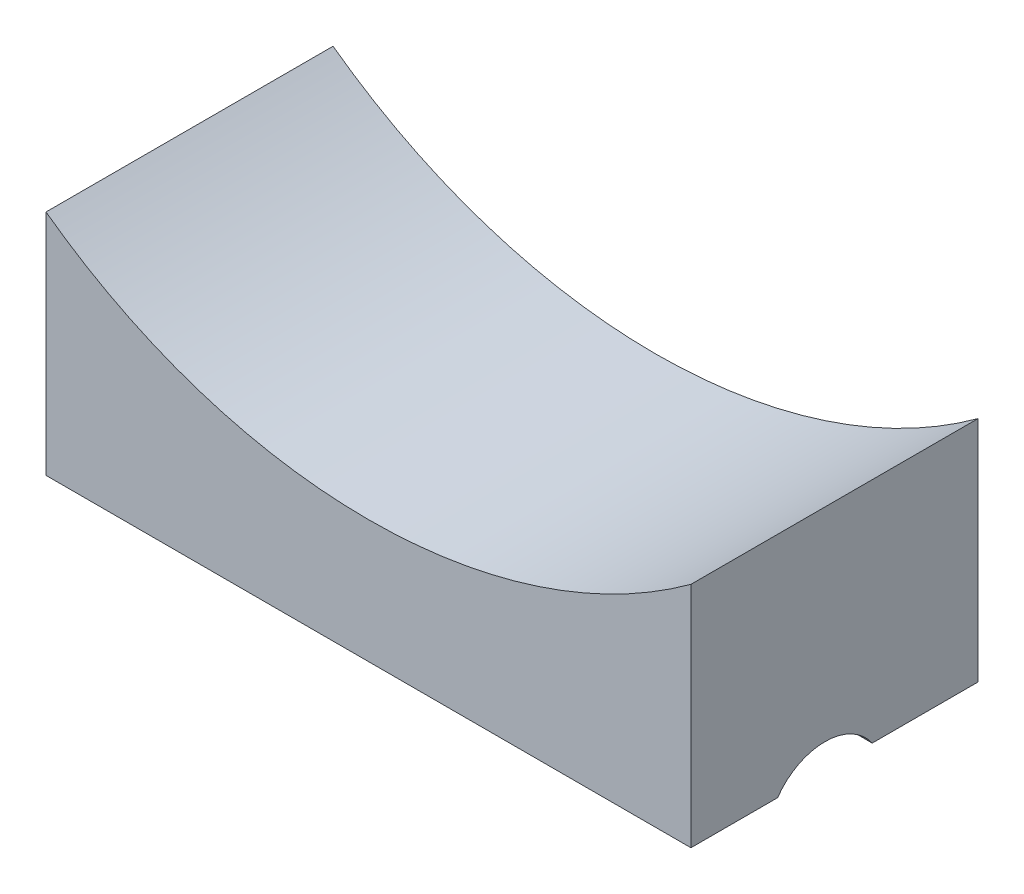
ISO-10303-21;
HEADER;
FILE_DESCRIPTION(('STEP AP214'),'2;1');
FILE_NAME('part.step','',(''),(''),'','','');
FILE_SCHEMA(('AUTOMOTIVE_DESIGN { 1 0 10303 214 1 1 1 1 }'));
ENDSEC;
DATA;
#1=APPLICATION_CONTEXT('core data for automotive mechanical design processes');
#2=APPLICATION_PROTOCOL_DEFINITION('international standard','automotive_design',2000,#1);
#3=PRODUCT_CONTEXT('',#1,'mechanical');
#4=PRODUCT('Part','Part','',(#3));
#5=PRODUCT_RELATED_PRODUCT_CATEGORY('part','',(#4));
#6=PRODUCT_DEFINITION_FORMATION('','',#4);
#7=PRODUCT_DEFINITION_CONTEXT('part definition',#1,'design');
#8=PRODUCT_DEFINITION('design','',#6,#7);
#9=PRODUCT_DEFINITION_SHAPE('','',#8);
#10=(LENGTH_UNIT() NAMED_UNIT(*) SI_UNIT(.MILLI.,.METRE.));
#11=(NAMED_UNIT(*) PLANE_ANGLE_UNIT() SI_UNIT($,.RADIAN.));
#12=(NAMED_UNIT(*) SI_UNIT($,.STERADIAN.) SOLID_ANGLE_UNIT());
#13=UNCERTAINTY_MEASURE_WITH_UNIT(LENGTH_MEASURE(1.E-05),#10,'distance_accuracy_value','');
#14=(GEOMETRIC_REPRESENTATION_CONTEXT(3) GLOBAL_UNCERTAINTY_ASSIGNED_CONTEXT((#13)) GLOBAL_UNIT_ASSIGNED_CONTEXT((#10,
#11,#12)) REPRESENTATION_CONTEXT('',''));
#15=CARTESIAN_POINT('',(0.,0.,0.));
#16=DIRECTION('',(0.,0.,1.));
#17=DIRECTION('',(1.,0.,0.));
#18=AXIS2_PLACEMENT_3D('',#15,#16,#17);
#19=CARTESIAN_POINT('',(33.7,0.,0.));
#20=DIRECTION('',(0.,1.,0.));
#21=DIRECTION('',(0.,0.,1.));
#22=AXIS2_PLACEMENT_3D('',#19,#20,#21);
#23=PLANE('',#22);
#24=DIRECTION('',(0.,0.,-1.));
#25=VECTOR('',#24,1.);
#26=CARTESIAN_POINT('',(0.,0.,0.));
#27=LINE('',#26,#25);
#28=CARTESIAN_POINT('',(0.,0.,0.));
#29=VERTEX_POINT('',#28);
#30=CARTESIAN_POINT('',(0.,0.,-2.19167388793148));
#31=VERTEX_POINT('',#30);
#32=EDGE_CURVE('E143',#29,#31,#27,.T.);
#33=ORIENTED_EDGE('',*,*,#32,.T.);
#34=DIRECTION('',(1.,0.,0.));
#35=VECTOR('',#34,1.);
#36=CARTESIAN_POINT('',(0.,0.,-2.19167388793148));
#37=LINE('',#36,#35);
#38=CARTESIAN_POINT('',(1.9,0.,-2.19167388793148));
#39=VERTEX_POINT('',#38);
#40=EDGE_CURVE('E119',#31,#39,#37,.T.);
#41=ORIENTED_EDGE('',*,*,#40,.T.);
#42=DIRECTION('',(0.,0.,-1.));
#43=VECTOR('',#42,1.);
#44=CARTESIAN_POINT('',(1.9,0.,0.));
#45=LINE('',#44,#43);
#46=CARTESIAN_POINT('',(1.9,0.,-0.976222115648685));
#47=VERTEX_POINT('',#46);
#48=EDGE_CURVE('E48',#47,#39,#45,.T.);
#49=ORIENTED_EDGE('',*,*,#48,.F.);
#50=DIRECTION('',(1.,0.,0.));
#51=VECTOR('',#50,1.);
#52=CARTESIAN_POINT('',(1.9,0.,-0.976222115648685));
#53=LINE('',#52,#51);
#54=CARTESIAN_POINT('',(9.2,0.,-0.976222115648685));
#55=VERTEX_POINT('',#54);
#56=EDGE_CURVE('E11',#47,#55,#53,.T.);
#57=ORIENTED_EDGE('',*,*,#56,.T.);
#58=DIRECTION('',(0.,0.,-1.));
#59=VECTOR('',#58,1.);
#60=CARTESIAN_POINT('',(9.2,0.,0.));
#61=LINE('',#60,#59);
#62=CARTESIAN_POINT('',(9.2,0.,-4.52815858113834));
#63=VERTEX_POINT('',#62);
#64=EDGE_CURVE('E189',#55,#63,#61,.T.);
#65=ORIENTED_EDGE('',*,*,#64,.T.);
#66=DIRECTION('',(1.,0.,0.));
#67=VECTOR('',#66,1.);
#68=CARTESIAN_POINT('',(9.2,0.,-4.52815858113834));
#69=LINE('',#68,#67);
#70=CARTESIAN_POINT('',(33.7,0.,-4.52815858113834));
#71=VERTEX_POINT('',#70);
#72=EDGE_CURVE('E203',#71,#63,#69,.F.);
#73=ORIENTED_EDGE('',*,*,#72,.F.);
#74=DIRECTION('',(0.,0.,-1.));
#75=VECTOR('',#74,1.);
#76=CARTESIAN_POINT('',(33.7,0.,0.));
#77=LINE('',#76,#75);
#78=CARTESIAN_POINT('',(33.7,0.,0.));
#79=VERTEX_POINT('',#78);
#80=EDGE_CURVE('E220',#79,#71,#77,.T.);
#81=ORIENTED_EDGE('',*,*,#80,.F.);
#82=DIRECTION('',(-1.,0.,0.));
#83=VECTOR('',#82,1.);
#84=CARTESIAN_POINT('',(33.7,0.,0.));
#85=LINE('',#84,#83);
#86=EDGE_CURVE('E158',#79,#29,#85,.T.);
#87=ORIENTED_EDGE('',*,*,#86,.T.);
#88=EDGE_LOOP('',(#33,#41,#49,#57,#65,#73,#81,#87));
#89=FACE_BOUND('',#88,.T.);
#90=ADVANCED_FACE('F39',(#89),#23,.F.);
#91=CARTESIAN_POINT('',(1.9,0.,-11.8083261120685));
#92=VERTEX_POINT('',#91);
#93=CARTESIAN_POINT('',(1.9,0.,-13.0237778843513));
#94=VERTEX_POINT('',#93);
#95=EDGE_CURVE('E134',#92,#94,#45,.T.);
#96=ORIENTED_EDGE('',*,*,#95,.F.);
#97=DIRECTION('',(1.,0.,0.));
#98=VECTOR('',#97,1.);
#99=CARTESIAN_POINT('',(0.,0.,-11.8083261120685));
#100=LINE('',#99,#98);
#101=CARTESIAN_POINT('',(0.,0.,-11.8083261120685));
#102=VERTEX_POINT('',#101);
#103=EDGE_CURVE('E55',#92,#102,#100,.F.);
#104=ORIENTED_EDGE('',*,*,#103,.T.);
#105=CARTESIAN_POINT('',(0.,0.,-15.));
#106=VERTEX_POINT('',#105);
#107=EDGE_CURVE('E131',#102,#106,#27,.T.);
#108=ORIENTED_EDGE('',*,*,#107,.T.);
#109=DIRECTION('',(-1.,0.,0.));
#110=VECTOR('',#109,1.);
#111=CARTESIAN_POINT('',(33.7,0.,-15.));
#112=LINE('',#111,#110);
#113=CARTESIAN_POINT('',(33.7,0.,-15.));
#114=VERTEX_POINT('',#113);
#115=EDGE_CURVE('E155',#114,#106,#112,.T.);
#116=ORIENTED_EDGE('',*,*,#115,.F.);
#117=CARTESIAN_POINT('',(33.7,0.,-9.47184141886166));
#118=VERTEX_POINT('',#117);
#119=EDGE_CURVE('E219',#118,#114,#77,.T.);
#120=ORIENTED_EDGE('',*,*,#119,.F.);
#121=DIRECTION('',(1.,0.,0.));
#122=VECTOR('',#121,1.);
#123=CARTESIAN_POINT('',(9.2,0.,-9.47184141886166));
#124=LINE('',#123,#122);
#125=CARTESIAN_POINT('',(9.2,0.,-9.47184141886166));
#126=VERTEX_POINT('',#125);
#127=EDGE_CURVE('E63',#126,#118,#124,.T.);
#128=ORIENTED_EDGE('',*,*,#127,.F.);
#129=CARTESIAN_POINT('',(9.2,0.,-13.0237778843513));
#130=VERTEX_POINT('',#129);
#131=EDGE_CURVE('E182',#126,#130,#61,.T.);
#132=ORIENTED_EDGE('',*,*,#131,.T.);
#133=DIRECTION('',(1.,0.,0.));
#134=VECTOR('',#133,1.);
#135=CARTESIAN_POINT('',(1.9,0.,-13.0237778843513));
#136=LINE('',#135,#134);
#137=EDGE_CURVE('E166',#130,#94,#136,.F.);
#138=ORIENTED_EDGE('',*,*,#137,.T.);
#139=EDGE_LOOP('',(#96,#104,#108,#116,#120,#128,#132,#138));
#140=FACE_BOUND('',#139,.T.);
#141=ADVANCED_FACE('F129',(#140),#23,.F.);
#142=CARTESIAN_POINT('',(33.7,0.,0.));
#143=DIRECTION('',(0.,0.,-1.));
#144=DIRECTION('',(-1.,0.,0.));
#145=AXIS2_PLACEMENT_3D('',#142,#143,#144);
#146=PLANE('',#145);
#147=DIRECTION('',(0.,-1.,0.));
#148=VECTOR('',#147,1.);
#149=CARTESIAN_POINT('',(33.7,0.,0.));
#150=LINE('',#149,#148);
#151=CARTESIAN_POINT('',(33.7,11.9216957945346,0.));
#152=VERTEX_POINT('',#151);
#153=EDGE_CURVE('E154',#152,#79,#150,.T.);
#154=ORIENTED_EDGE('',*,*,#153,.F.);
#155=CARTESIAN_POINT('',(16.85,35.,0.));
#156=DIRECTION('',(0.,0.,1.));
#157=DIRECTION('',(1.,0.,0.));
#158=AXIS2_PLACEMENT_3D('',#155,#156,#157);
#159=CIRCLE('',#158,28.575);
#160=CARTESIAN_POINT('',(0.,11.9216957945346,0.));
#161=VERTEX_POINT('',#160);
#162=EDGE_CURVE('E207',#161,#152,#159,.T.);
#163=ORIENTED_EDGE('',*,*,#162,.F.);
#164=DIRECTION('',(0.,-1.,0.));
#165=VECTOR('',#164,1.);
#166=CARTESIAN_POINT('',(0.,0.,0.));
#167=LINE('',#166,#165);
#168=EDGE_CURVE('E144',#161,#29,#167,.T.);
#169=ORIENTED_EDGE('',*,*,#168,.T.);
#170=ORIENTED_EDGE('',*,*,#86,.F.);
#171=EDGE_LOOP('',(#154,#163,#169,#170));
#172=FACE_BOUND('',#171,.T.);
#173=ADVANCED_FACE('F41',(#172),#146,.F.);
#174=CARTESIAN_POINT('',(33.7,0.,-15.));
#175=DIRECTION('',(0.,0.,1.));
#176=DIRECTION('',(0.,-1.,0.));
#177=AXIS2_PLACEMENT_3D('',#174,#175,#176);
#178=PLANE('',#177);
#179=DIRECTION('',(0.,1.,0.));
#180=VECTOR('',#179,1.);
#181=CARTESIAN_POINT('',(0.,0.,-15.));
#182=LINE('',#181,#180);
#183=CARTESIAN_POINT('',(0.,11.9216957945346,-15.));
#184=VERTEX_POINT('',#183);
#185=EDGE_CURVE('E141',#106,#184,#182,.T.);
#186=ORIENTED_EDGE('',*,*,#185,.T.);
#187=CARTESIAN_POINT('',(16.85,35.,-15.));
#188=DIRECTION('',(0.,0.,1.));
#189=DIRECTION('',(1.,0.,0.));
#190=AXIS2_PLACEMENT_3D('',#187,#188,#189);
#191=CIRCLE('',#190,28.575);
#192=CARTESIAN_POINT('',(33.7,11.9216957945346,-15.));
#193=VERTEX_POINT('',#192);
#194=EDGE_CURVE('E208',#184,#193,#191,.T.);
#195=ORIENTED_EDGE('',*,*,#194,.T.);
#196=DIRECTION('',(0.,1.,0.));
#197=VECTOR('',#196,1.);
#198=CARTESIAN_POINT('',(33.7,0.,-15.));
#199=LINE('',#198,#197);
#200=EDGE_CURVE('E159',#114,#193,#199,.T.);
#201=ORIENTED_EDGE('',*,*,#200,.F.);
#202=ORIENTED_EDGE('',*,*,#115,.T.);
#203=EDGE_LOOP('',(#186,#195,#201,#202));
#204=FACE_BOUND('',#203,.T.);
#205=ADVANCED_FACE('F230',(#204),#178,.F.);
#206=CARTESIAN_POINT('',(33.7,0.,0.));
#207=DIRECTION('',(-1.,0.,0.));
#208=DIRECTION('',(0.,0.,1.));
#209=AXIS2_PLACEMENT_3D('',#206,#207,#208);
#210=PLANE('',#209);
#211=CARTESIAN_POINT('',(33.7,-1.7,-7.));
#212=DIRECTION('',(-1.,0.,0.));
#213=DIRECTION('',(0.,0.,1.));
#214=AXIS2_PLACEMENT_3D('',#211,#212,#213);
#215=CIRCLE('',#214,3.);
#216=EDGE_CURVE('E193',#71,#118,#215,.T.);
#217=ORIENTED_EDGE('',*,*,#216,.T.);
#218=ORIENTED_EDGE('',*,*,#119,.T.);
#219=ORIENTED_EDGE('',*,*,#200,.T.);
#220=DIRECTION('',(0.,0.,1.));
#221=VECTOR('',#220,1.);
#222=CARTESIAN_POINT('',(33.7,11.9216957945347,-15.));
#223=LINE('',#222,#221);
#224=EDGE_CURVE('E148',#193,#152,#223,.T.);
#225=ORIENTED_EDGE('',*,*,#224,.T.);
#226=ORIENTED_EDGE('',*,*,#153,.T.);
#227=ORIENTED_EDGE('',*,*,#80,.T.);
#228=EDGE_LOOP('',(#217,#218,#219,#225,#226,#227));
#229=FACE_BOUND('',#228,.T.);
#230=ADVANCED_FACE('F227',(#229),#210,.F.);
#231=CARTESIAN_POINT('',(0.,0.,0.));
#232=DIRECTION('',(-1.,0.,0.));
#233=DIRECTION('',(0.,0.,1.));
#234=AXIS2_PLACEMENT_3D('',#231,#232,#233);
#235=PLANE('',#234);
#236=CARTESIAN_POINT('',(0.,-1.7,-7.));
#237=DIRECTION('',(1.,0.,0.));
#238=DIRECTION('',(0.,0.,-1.));
#239=AXIS2_PLACEMENT_3D('',#236,#237,#238);
#240=CIRCLE('',#239,5.1);
#241=EDGE_CURVE('E116',#102,#31,#240,.T.);
#242=ORIENTED_EDGE('',*,*,#241,.T.);
#243=ORIENTED_EDGE('',*,*,#32,.F.);
#244=ORIENTED_EDGE('',*,*,#168,.F.);
#245=DIRECTION('',(0.,0.,1.));
#246=VECTOR('',#245,1.);
#247=CARTESIAN_POINT('',(0.,11.9216957945347,-15.));
#248=LINE('',#247,#246);
#249=EDGE_CURVE('E163',#184,#161,#248,.T.);
#250=ORIENTED_EDGE('',*,*,#249,.F.);
#251=ORIENTED_EDGE('',*,*,#185,.F.);
#252=ORIENTED_EDGE('',*,*,#107,.F.);
#253=EDGE_LOOP('',(#242,#243,#244,#250,#251,#252));
#254=FACE_BOUND('',#253,.T.);
#255=ADVANCED_FACE('F138',(#254),#235,.T.);
#256=CARTESIAN_POINT('',(16.85,35.,-15.));
#257=DIRECTION('',(0.,0.,1.));
#258=DIRECTION('',(1.,0.,0.));
#259=AXIS2_PLACEMENT_3D('',#256,#257,#258);
#260=CYLINDRICAL_SURFACE('',#259,28.575);
#261=ORIENTED_EDGE('',*,*,#194,.F.);
#262=ORIENTED_EDGE('',*,*,#249,.T.);
#263=ORIENTED_EDGE('',*,*,#162,.T.);
#264=ORIENTED_EDGE('',*,*,#224,.F.);
#265=EDGE_LOOP('',(#261,#262,#263,#264));
#266=FACE_BOUND('',#265,.T.);
#267=ADVANCED_FACE('F232',(#266),#260,.F.);
#268=CARTESIAN_POINT('',(9.2,-1.7,-7.));
#269=DIRECTION('',(1.,0.,0.));
#270=DIRECTION('',(0.,0.,-1.));
#271=AXIS2_PLACEMENT_3D('',#268,#269,#270);
#272=CYLINDRICAL_SURFACE('',#271,3.);
#273=ORIENTED_EDGE('',*,*,#72,.T.);
#274=CARTESIAN_POINT('',(9.2,-1.7,-7.));
#275=DIRECTION('',(-1.,0.,0.));
#276=DIRECTION('',(0.,0.,1.));
#277=AXIS2_PLACEMENT_3D('',#274,#275,#276);
#278=CIRCLE('',#277,3.);
#279=EDGE_CURVE('E196',#63,#126,#278,.T.);
#280=ORIENTED_EDGE('',*,*,#279,.T.);
#281=ORIENTED_EDGE('',*,*,#127,.T.);
#282=ORIENTED_EDGE('',*,*,#216,.F.);
#283=EDGE_LOOP('',(#273,#280,#281,#282));
#284=FACE_BOUND('',#283,.T.);
#285=ADVANCED_FACE('F240',(#284),#272,.F.);
#286=CARTESIAN_POINT('',(1.9,-1.55,-7.));
#287=DIRECTION('',(1.,0.,0.));
#288=DIRECTION('',(0.,0.,-1.));
#289=AXIS2_PLACEMENT_3D('',#286,#287,#288);
#290=CYLINDRICAL_SURFACE('',#289,6.22);
#291=CARTESIAN_POINT('',(1.9,-1.55,-7.));
#292=DIRECTION('',(1.,0.,0.));
#293=DIRECTION('',(0.,0.,-1.));
#294=AXIS2_PLACEMENT_3D('',#291,#292,#293);
#295=CIRCLE('',#294,6.22);
#296=EDGE_CURVE('E176',#94,#47,#295,.T.);
#297=ORIENTED_EDGE('',*,*,#296,.F.);
#298=ORIENTED_EDGE('',*,*,#137,.F.);
#299=CARTESIAN_POINT('',(9.2,-1.55,-7.));
#300=DIRECTION('',(1.,0.,0.));
#301=DIRECTION('',(0.,0.,-1.));
#302=AXIS2_PLACEMENT_3D('',#299,#300,#301);
#303=CIRCLE('',#302,6.22);
#304=EDGE_CURVE('E183',#130,#55,#303,.T.);
#305=ORIENTED_EDGE('',*,*,#304,.T.);
#306=ORIENTED_EDGE('',*,*,#56,.F.);
#307=EDGE_LOOP('',(#297,#298,#305,#306));
#308=FACE_BOUND('',#307,.T.);
#309=ADVANCED_FACE('F178',(#308),#290,.F.);
#310=CARTESIAN_POINT('',(1.9,-1.55,-7.));
#311=DIRECTION('',(1.,0.,0.));
#312=DIRECTION('',(0.,0.,-1.));
#313=AXIS2_PLACEMENT_3D('',#310,#311,#312);
#314=PLANE('',#313);
#315=CARTESIAN_POINT('',(1.9,-1.7,-7.));
#316=DIRECTION('',(1.,0.,0.));
#317=DIRECTION('',(0.,0.,-1.));
#318=AXIS2_PLACEMENT_3D('',#315,#316,#317);
#319=CIRCLE('',#318,5.1);
#320=EDGE_CURVE('E125',#92,#39,#319,.T.);
#321=ORIENTED_EDGE('',*,*,#320,.F.);
#322=ORIENTED_EDGE('',*,*,#95,.T.);
#323=ORIENTED_EDGE('',*,*,#296,.T.);
#324=ORIENTED_EDGE('',*,*,#48,.T.);
#325=EDGE_LOOP('',(#321,#322,#323,#324));
#326=FACE_BOUND('',#325,.T.);
#327=ADVANCED_FACE('F175',(#326),#314,.T.);
#328=CARTESIAN_POINT('',(9.2,-1.55,-7.));
#329=DIRECTION('',(1.,0.,0.));
#330=DIRECTION('',(0.,0.,-1.));
#331=AXIS2_PLACEMENT_3D('',#328,#329,#330);
#332=PLANE('',#331);
#333=ORIENTED_EDGE('',*,*,#304,.F.);
#334=ORIENTED_EDGE('',*,*,#131,.F.);
#335=ORIENTED_EDGE('',*,*,#279,.F.);
#336=ORIENTED_EDGE('',*,*,#64,.F.);
#337=EDGE_LOOP('',(#333,#334,#335,#336));
#338=FACE_BOUND('',#337,.T.);
#339=ADVANCED_FACE('F242',(#338),#332,.F.);
#340=CARTESIAN_POINT('',(0.,-1.7,-7.));
#341=DIRECTION('',(1.,0.,0.));
#342=DIRECTION('',(0.,0.,-1.));
#343=AXIS2_PLACEMENT_3D('',#340,#341,#342);
#344=CYLINDRICAL_SURFACE('',#343,5.1);
#345=ORIENTED_EDGE('',*,*,#241,.F.);
#346=ORIENTED_EDGE('',*,*,#103,.F.);
#347=ORIENTED_EDGE('',*,*,#320,.T.);
#348=ORIENTED_EDGE('',*,*,#40,.F.);
#349=EDGE_LOOP('',(#345,#346,#347,#348));
#350=FACE_BOUND('',#349,.T.);
#351=ADVANCED_FACE('F117',(#350),#344,.F.);
#352=CLOSED_SHELL('',(#90,#141,#173,#205,#230,#255,#267,#285,#309,#327,#339,#351));
#353=MANIFOLD_SOLID_BREP('B2',#352);
#354=ADVANCED_BREP_SHAPE_REPRESENTATION('',(#18,#353),#14);
#355=SHAPE_DEFINITION_REPRESENTATION(#9,#354);
ENDSEC;
END-ISO-10303-21;
